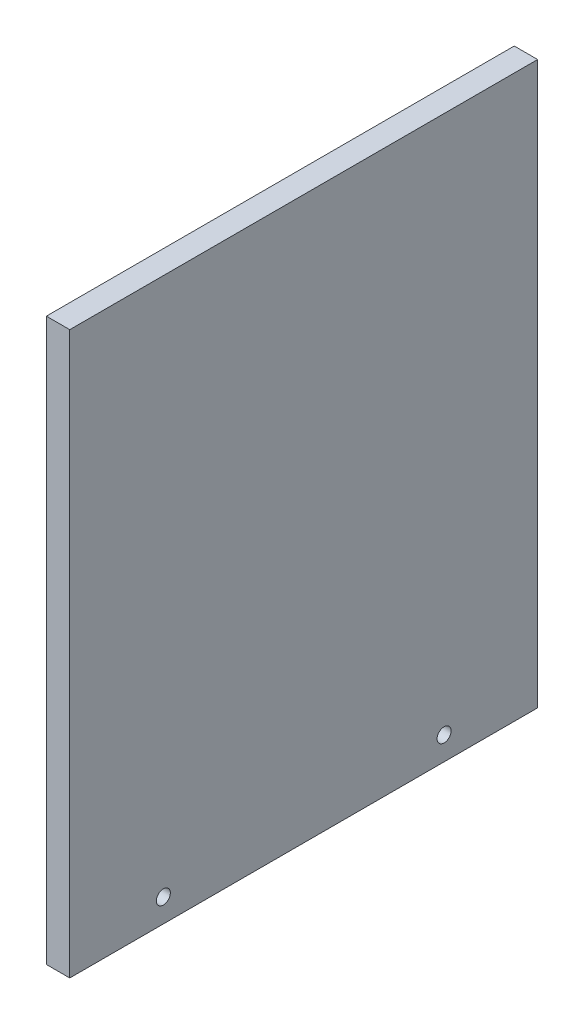
ISO-10303-21;
HEADER;
FILE_DESCRIPTION(('STEP AP214'),'2;1');
FILE_NAME('part.step','',(''),(''),'','','');
FILE_SCHEMA(('AUTOMOTIVE_DESIGN { 1 0 10303 214 1 1 1 1 }'));
ENDSEC;
DATA;
#1=APPLICATION_CONTEXT('core data for automotive mechanical design processes');
#2=APPLICATION_PROTOCOL_DEFINITION('international standard','automotive_design',2000,#1);
#3=PRODUCT_CONTEXT('',#1,'mechanical');
#4=PRODUCT('Part','Part','',(#3));
#5=PRODUCT_RELATED_PRODUCT_CATEGORY('part','',(#4));
#6=PRODUCT_DEFINITION_FORMATION('','',#4);
#7=PRODUCT_DEFINITION_CONTEXT('part definition',#1,'design');
#8=PRODUCT_DEFINITION('design','',#6,#7);
#9=PRODUCT_DEFINITION_SHAPE('','',#8);
#10=(LENGTH_UNIT() NAMED_UNIT(*) SI_UNIT(.MILLI.,.METRE.));
#11=(NAMED_UNIT(*) PLANE_ANGLE_UNIT() SI_UNIT($,.RADIAN.));
#12=(NAMED_UNIT(*) SI_UNIT($,.STERADIAN.) SOLID_ANGLE_UNIT());
#13=UNCERTAINTY_MEASURE_WITH_UNIT(LENGTH_MEASURE(1.E-05),#10,'distance_accuracy_value','');
#14=(GEOMETRIC_REPRESENTATION_CONTEXT(3) GLOBAL_UNCERTAINTY_ASSIGNED_CONTEXT((#13)) GLOBAL_UNIT_ASSIGNED_CONTEXT((#10,
#11,#12)) REPRESENTATION_CONTEXT('',''));
#15=CARTESIAN_POINT('',(0.,0.,0.));
#16=DIRECTION('',(0.,0.,1.));
#17=DIRECTION('',(1.,0.,0.));
#18=AXIS2_PLACEMENT_3D('',#15,#16,#17);
#19=CARTESIAN_POINT('',(5.,-120.,0.));
#20=DIRECTION('',(0.,0.,-1.));
#21=DIRECTION('',(-1.,0.,0.));
#22=AXIS2_PLACEMENT_3D('',#19,#20,#21);
#23=PLANE('',#22);
#24=DIRECTION('',(0.,-1.,0.));
#25=VECTOR('',#24,1.);
#26=CARTESIAN_POINT('',(0.,-120.,0.));
#27=LINE('',#26,#25);
#28=CARTESIAN_POINT('',(0.,0.,0.));
#29=VERTEX_POINT('',#28);
#30=CARTESIAN_POINT('',(0.,-120.,0.));
#31=VERTEX_POINT('',#30);
#32=EDGE_CURVE('E109',#29,#31,#27,.T.);
#33=ORIENTED_EDGE('',*,*,#32,.T.);
#34=DIRECTION('',(-1.,0.,0.));
#35=VECTOR('',#34,1.);
#36=CARTESIAN_POINT('',(5.,-120.,0.));
#37=LINE('',#36,#35);
#38=CARTESIAN_POINT('',(5.,-120.,0.));
#39=VERTEX_POINT('',#38);
#40=EDGE_CURVE('E11',#39,#31,#37,.T.);
#41=ORIENTED_EDGE('',*,*,#40,.F.);
#42=DIRECTION('',(0.,-1.,0.));
#43=VECTOR('',#42,1.);
#44=CARTESIAN_POINT('',(5.,-120.,0.));
#45=LINE('',#44,#43);
#46=CARTESIAN_POINT('',(5.,0.,0.));
#47=VERTEX_POINT('',#46);
#48=EDGE_CURVE('E92',#47,#39,#45,.T.);
#49=ORIENTED_EDGE('',*,*,#48,.F.);
#50=DIRECTION('',(-1.,0.,0.));
#51=VECTOR('',#50,1.);
#52=CARTESIAN_POINT('',(5.,0.,0.));
#53=LINE('',#52,#51);
#54=EDGE_CURVE('E105',#47,#29,#53,.T.);
#55=ORIENTED_EDGE('',*,*,#54,.T.);
#56=EDGE_LOOP('',(#33,#41,#49,#55));
#57=FACE_BOUND('',#56,.T.);
#58=ADVANCED_FACE('F38',(#57),#23,.F.);
#59=CARTESIAN_POINT('',(5.,-120.,-100.));
#60=DIRECTION('',(0.,1.,0.));
#61=DIRECTION('',(0.,0.,1.));
#62=AXIS2_PLACEMENT_3D('',#59,#60,#61);
#63=PLANE('',#62);
#64=DIRECTION('',(0.,0.,-1.));
#65=VECTOR('',#64,1.);
#66=CARTESIAN_POINT('',(0.,-120.,-100.));
#67=LINE('',#66,#65);
#68=CARTESIAN_POINT('',(0.,-120.,-100.));
#69=VERTEX_POINT('',#68);
#70=EDGE_CURVE('E97',#31,#69,#67,.T.);
#71=ORIENTED_EDGE('',*,*,#70,.T.);
#72=DIRECTION('',(-1.,0.,0.));
#73=VECTOR('',#72,1.);
#74=CARTESIAN_POINT('',(5.,-120.,-100.));
#75=LINE('',#74,#73);
#76=CARTESIAN_POINT('',(5.,-120.,-100.));
#77=VERTEX_POINT('',#76);
#78=EDGE_CURVE('E48',#77,#69,#75,.T.);
#79=ORIENTED_EDGE('',*,*,#78,.F.);
#80=DIRECTION('',(0.,0.,-1.));
#81=VECTOR('',#80,1.);
#82=CARTESIAN_POINT('',(5.,-120.,-100.));
#83=LINE('',#82,#81);
#84=EDGE_CURVE('E87',#39,#77,#83,.T.);
#85=ORIENTED_EDGE('',*,*,#84,.F.);
#86=ORIENTED_EDGE('',*,*,#40,.T.);
#87=EDGE_LOOP('',(#71,#79,#85,#86));
#88=FACE_BOUND('',#87,.T.);
#89=ADVANCED_FACE('F96',(#88),#63,.F.);
#90=CARTESIAN_POINT('',(5.,0.,-100.));
#91=DIRECTION('',(0.,0.,1.));
#92=DIRECTION('',(0.,-1.,0.));
#93=AXIS2_PLACEMENT_3D('',#90,#91,#92);
#94=PLANE('',#93);
#95=DIRECTION('',(0.,1.,0.));
#96=VECTOR('',#95,1.);
#97=CARTESIAN_POINT('',(0.,0.,-100.));
#98=LINE('',#97,#96);
#99=CARTESIAN_POINT('',(0.,0.,-100.));
#100=VERTEX_POINT('',#99);
#101=EDGE_CURVE('E74',#69,#100,#98,.T.);
#102=ORIENTED_EDGE('',*,*,#101,.T.);
#103=DIRECTION('',(-1.,0.,0.));
#104=VECTOR('',#103,1.);
#105=CARTESIAN_POINT('',(5.,0.,-100.));
#106=LINE('',#105,#104);
#107=CARTESIAN_POINT('',(5.,0.,-100.));
#108=VERTEX_POINT('',#107);
#109=EDGE_CURVE('E99',#108,#100,#106,.T.);
#110=ORIENTED_EDGE('',*,*,#109,.F.);
#111=DIRECTION('',(0.,1.,0.));
#112=VECTOR('',#111,1.);
#113=CARTESIAN_POINT('',(5.,0.,-100.));
#114=LINE('',#113,#112);
#115=EDGE_CURVE('E90',#77,#108,#114,.T.);
#116=ORIENTED_EDGE('',*,*,#115,.F.);
#117=ORIENTED_EDGE('',*,*,#78,.T.);
#118=EDGE_LOOP('',(#102,#110,#116,#117));
#119=FACE_BOUND('',#118,.T.);
#120=ADVANCED_FACE('F101',(#119),#94,.F.);
#121=CARTESIAN_POINT('',(5.,0.,0.));
#122=DIRECTION('',(0.,-1.,0.));
#123=DIRECTION('',(0.,0.,-1.));
#124=AXIS2_PLACEMENT_3D('',#121,#122,#123);
#125=PLANE('',#124);
#126=DIRECTION('',(0.,0.,1.));
#127=VECTOR('',#126,1.);
#128=CARTESIAN_POINT('',(0.,0.,0.));
#129=LINE('',#128,#127);
#130=EDGE_CURVE('E80',#100,#29,#129,.T.);
#131=ORIENTED_EDGE('',*,*,#130,.T.);
#132=ORIENTED_EDGE('',*,*,#54,.F.);
#133=DIRECTION('',(0.,0.,1.));
#134=VECTOR('',#133,1.);
#135=CARTESIAN_POINT('',(5.,0.,0.));
#136=LINE('',#135,#134);
#137=EDGE_CURVE('E57',#108,#47,#136,.T.);
#138=ORIENTED_EDGE('',*,*,#137,.F.);
#139=ORIENTED_EDGE('',*,*,#109,.T.);
#140=EDGE_LOOP('',(#131,#132,#138,#139));
#141=FACE_BOUND('',#140,.T.);
#142=ADVANCED_FACE('F146',(#141),#125,.F.);
#143=CARTESIAN_POINT('',(5.,0.,0.));
#144=DIRECTION('',(-1.,0.,0.));
#145=DIRECTION('',(0.,0.,1.));
#146=AXIS2_PLACEMENT_3D('',#143,#144,#145);
#147=PLANE('',#146);
#148=CARTESIAN_POINT('',(5.,-115.,-20.));
#149=DIRECTION('',(1.,0.,0.));
#150=DIRECTION('',(0.,0.,-1.));
#151=AXIS2_PLACEMENT_3D('',#148,#149,#150);
#152=CIRCLE('',#151,1.5);
#153=CARTESIAN_POINT('',(5.,-115.,-21.5));
#154=VERTEX_POINT('',#153);
#155=EDGE_CURVE('E125',#154,#154,#152,.T.);
#156=ORIENTED_EDGE('',*,*,#155,.F.);
#157=EDGE_LOOP('',(#156));
#158=FACE_BOUND('',#157,.T.);
#159=CARTESIAN_POINT('',(5.,-115.,-80.));
#160=DIRECTION('',(1.,0.,0.));
#161=DIRECTION('',(0.,0.,-1.));
#162=AXIS2_PLACEMENT_3D('',#159,#160,#161);
#163=CIRCLE('',#162,1.5);
#164=CARTESIAN_POINT('',(5.,-115.,-81.5));
#165=VERTEX_POINT('',#164);
#166=EDGE_CURVE('E132',#165,#165,#163,.T.);
#167=ORIENTED_EDGE('',*,*,#166,.F.);
#168=EDGE_LOOP('',(#167));
#169=FACE_BOUND('',#168,.T.);
#170=ORIENTED_EDGE('',*,*,#48,.T.);
#171=ORIENTED_EDGE('',*,*,#84,.T.);
#172=ORIENTED_EDGE('',*,*,#115,.T.);
#173=ORIENTED_EDGE('',*,*,#137,.T.);
#174=EDGE_LOOP('',(#170,#171,#172,#173));
#175=FACE_BOUND('',#174,.T.);
#176=ADVANCED_FACE('F88',(#158,#169,#175),#147,.F.);
#177=CARTESIAN_POINT('',(0.,0.,0.));
#178=DIRECTION('',(-1.,0.,0.));
#179=DIRECTION('',(0.,0.,1.));
#180=AXIS2_PLACEMENT_3D('',#177,#178,#179);
#181=PLANE('',#180);
#182=CARTESIAN_POINT('',(0.,-115.,-20.));
#183=DIRECTION('',(-1.,0.,0.));
#184=DIRECTION('',(0.,0.,1.));
#185=AXIS2_PLACEMENT_3D('',#182,#183,#184);
#186=CIRCLE('',#185,1.5);
#187=CARTESIAN_POINT('',(0.,-115.,-18.5));
#188=VERTEX_POINT('',#187);
#189=EDGE_CURVE('E41',#188,#188,#186,.T.);
#190=ORIENTED_EDGE('',*,*,#189,.F.);
#191=EDGE_LOOP('',(#190));
#192=FACE_BOUND('',#191,.T.);
#193=CARTESIAN_POINT('',(0.,-115.,-80.));
#194=DIRECTION('',(-1.,0.,0.));
#195=DIRECTION('',(0.,0.,1.));
#196=AXIS2_PLACEMENT_3D('',#193,#194,#195);
#197=CIRCLE('',#196,1.5);
#198=CARTESIAN_POINT('',(0.,-115.,-78.5));
#199=VERTEX_POINT('',#198);
#200=EDGE_CURVE('E122',#199,#199,#197,.T.);
#201=ORIENTED_EDGE('',*,*,#200,.F.);
#202=EDGE_LOOP('',(#201));
#203=FACE_BOUND('',#202,.T.);
#204=ORIENTED_EDGE('',*,*,#32,.F.);
#205=ORIENTED_EDGE('',*,*,#130,.F.);
#206=ORIENTED_EDGE('',*,*,#101,.F.);
#207=ORIENTED_EDGE('',*,*,#70,.F.);
#208=EDGE_LOOP('',(#204,#205,#206,#207));
#209=FACE_BOUND('',#208,.T.);
#210=ADVANCED_FACE('F145',(#192,#203,#209),#181,.T.);
#211=CARTESIAN_POINT('',(-5.,-115.,-80.));
#212=DIRECTION('',(1.,0.,0.));
#213=DIRECTION('',(0.,0.,-1.));
#214=AXIS2_PLACEMENT_3D('',#211,#212,#213);
#215=CYLINDRICAL_SURFACE('',#214,1.5);
#216=ORIENTED_EDGE('',*,*,#200,.T.);
#217=EDGE_LOOP('',(#216));
#218=FACE_BOUND('',#217,.T.);
#219=ORIENTED_EDGE('',*,*,#166,.T.);
#220=EDGE_LOOP('',(#219));
#221=FACE_BOUND('',#220,.T.);
#222=ADVANCED_FACE('F142',(#218,#221),#215,.F.);
#223=CARTESIAN_POINT('',(-5.,-115.,-20.));
#224=DIRECTION('',(1.,0.,0.));
#225=DIRECTION('',(0.,0.,-1.));
#226=AXIS2_PLACEMENT_3D('',#223,#224,#225);
#227=CYLINDRICAL_SURFACE('',#226,1.5);
#228=ORIENTED_EDGE('',*,*,#189,.T.);
#229=EDGE_LOOP('',(#228));
#230=FACE_BOUND('',#229,.T.);
#231=ORIENTED_EDGE('',*,*,#155,.T.);
#232=EDGE_LOOP('',(#231));
#233=FACE_BOUND('',#232,.T.);
#234=ADVANCED_FACE('F191',(#230,#233),#227,.F.);
#235=CLOSED_SHELL('',(#58,#89,#120,#142,#176,#210,#222,#234));
#236=MANIFOLD_SOLID_BREP('B2',#235);
#237=ADVANCED_BREP_SHAPE_REPRESENTATION('',(#18,#236),#14);
#238=SHAPE_DEFINITION_REPRESENTATION(#9,#237);
ENDSEC;
END-ISO-10303-21;
